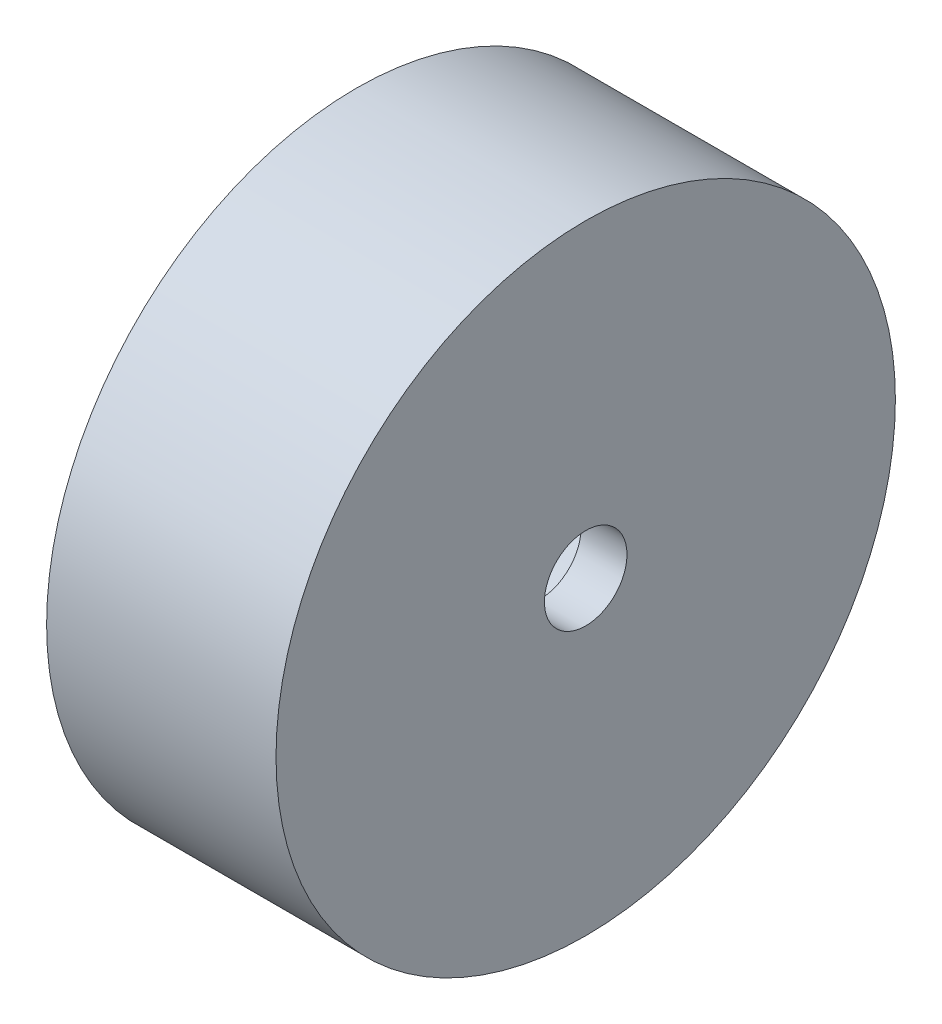
ISO-10303-21;
HEADER;
FILE_DESCRIPTION(('STEP AP214'),'2;1');
FILE_NAME('part.step','',(''),(''),'','','');
FILE_SCHEMA(('AUTOMOTIVE_DESIGN { 1 0 10303 214 1 1 1 1 }'));
ENDSEC;
DATA;
#1=APPLICATION_CONTEXT('core data for automotive mechanical design processes');
#2=APPLICATION_PROTOCOL_DEFINITION('international standard','automotive_design',2000,#1);
#3=PRODUCT_CONTEXT('',#1,'mechanical');
#4=PRODUCT('Part','Part','',(#3));
#5=PRODUCT_RELATED_PRODUCT_CATEGORY('part','',(#4));
#6=PRODUCT_DEFINITION_FORMATION('','',#4);
#7=PRODUCT_DEFINITION_CONTEXT('part definition',#1,'design');
#8=PRODUCT_DEFINITION('design','',#6,#7);
#9=PRODUCT_DEFINITION_SHAPE('','',#8);
#10=(LENGTH_UNIT() NAMED_UNIT(*) SI_UNIT(.MILLI.,.METRE.));
#11=(NAMED_UNIT(*) PLANE_ANGLE_UNIT() SI_UNIT($,.RADIAN.));
#12=(NAMED_UNIT(*) SI_UNIT($,.STERADIAN.) SOLID_ANGLE_UNIT());
#13=UNCERTAINTY_MEASURE_WITH_UNIT(LENGTH_MEASURE(1.E-05),#10,'distance_accuracy_value','');
#14=(GEOMETRIC_REPRESENTATION_CONTEXT(3) GLOBAL_UNCERTAINTY_ASSIGNED_CONTEXT((#13)) GLOBAL_UNIT_ASSIGNED_CONTEXT((#10,
#11,#12)) REPRESENTATION_CONTEXT('',''));
#15=CARTESIAN_POINT('',(0.,0.,0.));
#16=DIRECTION('',(0.,0.,1.));
#17=DIRECTION('',(1.,0.,0.));
#18=AXIS2_PLACEMENT_3D('',#15,#16,#17);
#19=CARTESIAN_POINT('',(45.,0.,0.));
#20=DIRECTION('',(1.,0.,0.));
#21=DIRECTION('',(0.,0.,-1.));
#22=AXIS2_PLACEMENT_3D('',#19,#20,#21);
#23=PLANE('',#22);
#24=CARTESIAN_POINT('',(45.,0.,0.));
#25=DIRECTION('',(1.,0.,0.));
#26=DIRECTION('',(0.,0.,-1.));
#27=AXIS2_PLACEMENT_3D('',#24,#25,#26);
#28=CIRCLE('',#27,1.8);
#29=CARTESIAN_POINT('',(45.,0.,-1.8));
#30=VERTEX_POINT('',#29);
#31=EDGE_CURVE('E151',#30,#30,#28,.T.);
#32=ORIENTED_EDGE('',*,*,#31,.F.);
#33=EDGE_LOOP('',(#32));
#34=FACE_BOUND('',#33,.T.);
#35=CARTESIAN_POINT('',(45.,0.,0.));
#36=DIRECTION('',(1.,0.,0.));
#37=DIRECTION('',(0.,0.,-1.));
#38=AXIS2_PLACEMENT_3D('',#35,#36,#37);
#39=CIRCLE('',#38,13.5);
#40=CARTESIAN_POINT('',(45.,0.,-13.5));
#41=VERTEX_POINT('',#40);
#42=EDGE_CURVE('E162',#41,#41,#39,.F.);
#43=ORIENTED_EDGE('',*,*,#42,.F.);
#44=EDGE_LOOP('',(#43));
#45=FACE_BOUND('',#44,.T.);
#46=ADVANCED_FACE('F34',(#34,#45),#23,.T.);
#47=CARTESIAN_POINT('',(38.,0.,0.));
#48=DIRECTION('',(-1.,0.,0.));
#49=DIRECTION('',(0.,0.,1.));
#50=AXIS2_PLACEMENT_3D('',#47,#48,#49);
#51=PLANE('',#50);
#52=DIRECTION('',(0.,0.5,-0.866025403784439));
#53=VECTOR('',#52,1.);
#54=CARTESIAN_POINT('',(38.,4.99407982849026,8.65));
#55=LINE('',#54,#53);
#56=CARTESIAN_POINT('',(38.,4.99407982849026,8.65));
#57=VERTEX_POINT('',#56);
#58=CARTESIAN_POINT('',(38.,9.98815965698052,0.));
#59=VERTEX_POINT('',#58);
#60=EDGE_CURVE('E122',#57,#59,#55,.T.);
#61=ORIENTED_EDGE('',*,*,#60,.F.);
#62=DIRECTION('',(0.,1.,0.));
#63=VECTOR('',#62,1.);
#64=CARTESIAN_POINT('',(38.,-4.99407982849027,8.65));
#65=LINE('',#64,#63);
#66=CARTESIAN_POINT('',(38.,-4.99407982849027,8.65));
#67=VERTEX_POINT('',#66);
#68=EDGE_CURVE('E97',#67,#57,#65,.T.);
#69=ORIENTED_EDGE('',*,*,#68,.F.);
#70=DIRECTION('',(0.,0.5,0.866025403784439));
#71=VECTOR('',#70,1.);
#72=CARTESIAN_POINT('',(38.,-9.98815965698053,0.));
#73=LINE('',#72,#71);
#74=CARTESIAN_POINT('',(38.,-9.98815965698053,0.));
#75=VERTEX_POINT('',#74);
#76=EDGE_CURVE('E102',#75,#67,#73,.T.);
#77=ORIENTED_EDGE('',*,*,#76,.F.);
#78=DIRECTION('',(0.,-0.500000000000001,0.866025403784438));
#79=VECTOR('',#78,1.);
#80=CARTESIAN_POINT('',(38.,-4.99407982849026,-8.65));
#81=LINE('',#80,#79);
#82=CARTESIAN_POINT('',(38.,-4.99407982849026,-8.65));
#83=VERTEX_POINT('',#82);
#84=EDGE_CURVE('E106',#83,#75,#81,.T.);
#85=ORIENTED_EDGE('',*,*,#84,.F.);
#86=DIRECTION('',(0.,-1.,0.));
#87=VECTOR('',#86,1.);
#88=CARTESIAN_POINT('',(38.,4.99407982849026,-8.65));
#89=LINE('',#88,#87);
#90=CARTESIAN_POINT('',(38.,4.99407982849026,-8.65));
#91=VERTEX_POINT('',#90);
#92=EDGE_CURVE('E135',#91,#83,#89,.T.);
#93=ORIENTED_EDGE('',*,*,#92,.F.);
#94=DIRECTION('',(0.,-0.5,-0.866025403784439));
#95=VECTOR('',#94,1.);
#96=CARTESIAN_POINT('',(38.,9.98815965698052,0.));
#97=LINE('',#96,#95);
#98=EDGE_CURVE('E127',#59,#91,#97,.T.);
#99=ORIENTED_EDGE('',*,*,#98,.F.);
#100=EDGE_LOOP('',(#61,#69,#77,#85,#93,#99));
#101=FACE_BOUND('',#100,.T.);
#102=CARTESIAN_POINT('',(38.,0.,0.));
#103=DIRECTION('',(-1.,0.,0.));
#104=DIRECTION('',(0.,0.,1.));
#105=AXIS2_PLACEMENT_3D('',#102,#103,#104);
#106=CIRCLE('',#105,10.175);
#107=CARTESIAN_POINT('',(38.,0.,10.175));
#108=VERTEX_POINT('',#107);
#109=EDGE_CURVE('E11',#108,#108,#106,.F.);
#110=ORIENTED_EDGE('',*,*,#109,.F.);
#111=EDGE_LOOP('',(#110));
#112=FACE_BOUND('',#111,.T.);
#113=ADVANCED_FACE('F132',(#101,#112),#51,.T.);
#114=CARTESIAN_POINT('',(38.,-4.99407982849027,8.65));
#115=DIRECTION('',(0.,0.,-1.));
#116=DIRECTION('',(-1.,0.,0.));
#117=AXIS2_PLACEMENT_3D('',#114,#115,#116);
#118=PLANE('',#117);
#119=DIRECTION('',(1.,0.,0.));
#120=VECTOR('',#119,1.);
#121=CARTESIAN_POINT('',(38.,4.99407982849026,8.65));
#122=LINE('',#121,#120);
#123=CARTESIAN_POINT('',(43.,4.99407982849026,8.65));
#124=VERTEX_POINT('',#123);
#125=EDGE_CURVE('E89',#57,#124,#122,.T.);
#126=ORIENTED_EDGE('',*,*,#125,.T.);
#127=DIRECTION('',(0.,-1.,0.));
#128=VECTOR('',#127,1.);
#129=CARTESIAN_POINT('',(43.,-4.99407982849027,8.65));
#130=LINE('',#129,#128);
#131=CARTESIAN_POINT('',(43.,-4.99407982849027,8.65));
#132=VERTEX_POINT('',#131);
#133=EDGE_CURVE('E86',#124,#132,#130,.T.);
#134=ORIENTED_EDGE('',*,*,#133,.T.);
#135=DIRECTION('',(1.,0.,0.));
#136=VECTOR('',#135,1.);
#137=CARTESIAN_POINT('',(38.,-4.99407982849027,8.65));
#138=LINE('',#137,#136);
#139=EDGE_CURVE('E94',#67,#132,#138,.T.);
#140=ORIENTED_EDGE('',*,*,#139,.F.);
#141=ORIENTED_EDGE('',*,*,#68,.T.);
#142=EDGE_LOOP('',(#126,#134,#140,#141));
#143=FACE_BOUND('',#142,.T.);
#144=ADVANCED_FACE('F93',(#143),#118,.T.);
#145=CARTESIAN_POINT('',(38.,4.99407982849026,8.65));
#146=DIRECTION('',(0.,-0.866025403784439,-0.5));
#147=DIRECTION('',(0.,0.5,-0.866025403784439));
#148=AXIS2_PLACEMENT_3D('',#145,#146,#147);
#149=PLANE('',#148);
#150=DIRECTION('',(1.,0.,0.));
#151=VECTOR('',#150,1.);
#152=CARTESIAN_POINT('',(38.,9.98815965698052,0.));
#153=LINE('',#152,#151);
#154=CARTESIAN_POINT('',(43.,9.98815965698052,0.));
#155=VERTEX_POINT('',#154);
#156=EDGE_CURVE('E115',#59,#155,#153,.T.);
#157=ORIENTED_EDGE('',*,*,#156,.T.);
#158=DIRECTION('',(0.,-0.5,0.866025403784439));
#159=VECTOR('',#158,1.);
#160=CARTESIAN_POINT('',(43.,4.99407982849026,8.65));
#161=LINE('',#160,#159);
#162=EDGE_CURVE('E98',#155,#124,#161,.T.);
#163=ORIENTED_EDGE('',*,*,#162,.T.);
#164=ORIENTED_EDGE('',*,*,#125,.F.);
#165=ORIENTED_EDGE('',*,*,#60,.T.);
#166=EDGE_LOOP('',(#157,#163,#164,#165));
#167=FACE_BOUND('',#166,.T.);
#168=ADVANCED_FACE('F120',(#167),#149,.T.);
#169=CARTESIAN_POINT('',(38.,9.98815965698052,0.));
#170=DIRECTION('',(0.,-0.866025403784439,0.5));
#171=DIRECTION('',(0.,-0.5,-0.866025403784439));
#172=AXIS2_PLACEMENT_3D('',#169,#170,#171);
#173=PLANE('',#172);
#174=DIRECTION('',(1.,0.,0.));
#175=VECTOR('',#174,1.);
#176=CARTESIAN_POINT('',(38.,4.99407982849026,-8.65));
#177=LINE('',#176,#175);
#178=CARTESIAN_POINT('',(43.,4.99407982849026,-8.65));
#179=VERTEX_POINT('',#178);
#180=EDGE_CURVE('E112',#91,#179,#177,.T.);
#181=ORIENTED_EDGE('',*,*,#180,.T.);
#182=DIRECTION('',(0.,0.5,0.866025403784439));
#183=VECTOR('',#182,1.);
#184=CARTESIAN_POINT('',(43.,9.98815965698052,0.));
#185=LINE('',#184,#183);
#186=EDGE_CURVE('E129',#179,#155,#185,.T.);
#187=ORIENTED_EDGE('',*,*,#186,.T.);
#188=ORIENTED_EDGE('',*,*,#156,.F.);
#189=ORIENTED_EDGE('',*,*,#98,.T.);
#190=EDGE_LOOP('',(#181,#187,#188,#189));
#191=FACE_BOUND('',#190,.T.);
#192=ADVANCED_FACE('F126',(#191),#173,.T.);
#193=CARTESIAN_POINT('',(38.,4.99407982849026,-8.65));
#194=DIRECTION('',(0.,0.,1.));
#195=DIRECTION('',(0.,-1.,0.));
#196=AXIS2_PLACEMENT_3D('',#193,#194,#195);
#197=PLANE('',#196);
#198=DIRECTION('',(1.,0.,0.));
#199=VECTOR('',#198,1.);
#200=CARTESIAN_POINT('',(38.,-4.99407982849026,-8.65));
#201=LINE('',#200,#199);
#202=CARTESIAN_POINT('',(43.,-4.99407982849026,-8.65));
#203=VERTEX_POINT('',#202);
#204=EDGE_CURVE('E104',#83,#203,#201,.T.);
#205=ORIENTED_EDGE('',*,*,#204,.T.);
#206=DIRECTION('',(0.,1.,0.));
#207=VECTOR('',#206,1.);
#208=CARTESIAN_POINT('',(43.,4.99407982849026,-8.65));
#209=LINE('',#208,#207);
#210=EDGE_CURVE('E146',#203,#179,#209,.T.);
#211=ORIENTED_EDGE('',*,*,#210,.T.);
#212=ORIENTED_EDGE('',*,*,#180,.F.);
#213=ORIENTED_EDGE('',*,*,#92,.T.);
#214=EDGE_LOOP('',(#205,#211,#212,#213));
#215=FACE_BOUND('',#214,.T.);
#216=ADVANCED_FACE('F194',(#215),#197,.T.);
#217=CARTESIAN_POINT('',(38.,-4.99407982849026,-8.65));
#218=DIRECTION('',(0.,0.866025403784438,0.500000000000001));
#219=DIRECTION('',(0.,-0.500000000000001,0.866025403784438));
#220=AXIS2_PLACEMENT_3D('',#217,#218,#219);
#221=PLANE('',#220);
#222=DIRECTION('',(1.,0.,0.));
#223=VECTOR('',#222,1.);
#224=CARTESIAN_POINT('',(38.,-9.98815965698053,0.));
#225=LINE('',#224,#223);
#226=CARTESIAN_POINT('',(43.,-9.98815965698053,0.));
#227=VERTEX_POINT('',#226);
#228=EDGE_CURVE('E55',#75,#227,#225,.T.);
#229=ORIENTED_EDGE('',*,*,#228,.T.);
#230=DIRECTION('',(0.,0.500000000000001,-0.866025403784438));
#231=VECTOR('',#230,1.);
#232=CARTESIAN_POINT('',(43.,-4.99407982849026,-8.65));
#233=LINE('',#232,#231);
#234=EDGE_CURVE('E48',#227,#203,#233,.T.);
#235=ORIENTED_EDGE('',*,*,#234,.T.);
#236=ORIENTED_EDGE('',*,*,#204,.F.);
#237=ORIENTED_EDGE('',*,*,#84,.T.);
#238=EDGE_LOOP('',(#229,#235,#236,#237));
#239=FACE_BOUND('',#238,.T.);
#240=ADVANCED_FACE('F142',(#239),#221,.T.);
#241=CARTESIAN_POINT('',(38.,-9.98815965698053,0.));
#242=DIRECTION('',(0.,0.866025403784439,-0.5));
#243=DIRECTION('',(0.,0.5,0.866025403784439));
#244=AXIS2_PLACEMENT_3D('',#241,#242,#243);
#245=PLANE('',#244);
#246=ORIENTED_EDGE('',*,*,#139,.T.);
#247=DIRECTION('',(0.,-0.5,-0.866025403784439));
#248=VECTOR('',#247,1.);
#249=CARTESIAN_POINT('',(43.,-9.98815965698053,0.));
#250=LINE('',#249,#248);
#251=EDGE_CURVE('E41',#132,#227,#250,.T.);
#252=ORIENTED_EDGE('',*,*,#251,.T.);
#253=ORIENTED_EDGE('',*,*,#228,.F.);
#254=ORIENTED_EDGE('',*,*,#76,.T.);
#255=EDGE_LOOP('',(#246,#252,#253,#254));
#256=FACE_BOUND('',#255,.T.);
#257=ADVANCED_FACE('F100',(#256),#245,.T.);
#258=CARTESIAN_POINT('',(43.,0.,0.));
#259=DIRECTION('',(1.,0.,0.));
#260=DIRECTION('',(0.,0.,-1.));
#261=AXIS2_PLACEMENT_3D('',#258,#259,#260);
#262=PLANE('',#261);
#263=ORIENTED_EDGE('',*,*,#133,.F.);
#264=ORIENTED_EDGE('',*,*,#162,.F.);
#265=ORIENTED_EDGE('',*,*,#186,.F.);
#266=ORIENTED_EDGE('',*,*,#210,.F.);
#267=ORIENTED_EDGE('',*,*,#234,.F.);
#268=ORIENTED_EDGE('',*,*,#251,.F.);
#269=EDGE_LOOP('',(#263,#264,#265,#266,#267,#268));
#270=FACE_BOUND('',#269,.T.);
#271=CARTESIAN_POINT('',(43.,0.,0.));
#272=DIRECTION('',(1.,0.,0.));
#273=DIRECTION('',(0.,0.,-1.));
#274=AXIS2_PLACEMENT_3D('',#271,#272,#273);
#275=CIRCLE('',#274,1.8);
#276=CARTESIAN_POINT('',(43.,0.,-1.8));
#277=VERTEX_POINT('',#276);
#278=EDGE_CURVE('E150',#277,#277,#275,.T.);
#279=ORIENTED_EDGE('',*,*,#278,.T.);
#280=EDGE_LOOP('',(#279));
#281=FACE_BOUND('',#280,.T.);
#282=ADVANCED_FACE('F84',(#270,#281),#262,.F.);
#283=CARTESIAN_POINT('',(43.,0.,0.));
#284=DIRECTION('',(1.,0.,0.));
#285=DIRECTION('',(0.,0.,-1.));
#286=AXIS2_PLACEMENT_3D('',#283,#284,#285);
#287=CYLINDRICAL_SURFACE('',#286,1.8);
#288=ORIENTED_EDGE('',*,*,#278,.F.);
#289=EDGE_LOOP('',(#288));
#290=FACE_BOUND('',#289,.T.);
#291=ORIENTED_EDGE('',*,*,#31,.T.);
#292=EDGE_LOOP('',(#291));
#293=FACE_BOUND('',#292,.T.);
#294=ADVANCED_FACE('F175',(#290,#293),#287,.F.);
#295=CARTESIAN_POINT('',(35.,0.,0.));
#296=DIRECTION('',(-1.,0.,0.));
#297=DIRECTION('',(0.,0.,1.));
#298=AXIS2_PLACEMENT_3D('',#295,#296,#297);
#299=PLANE('',#298);
#300=CARTESIAN_POINT('',(35.,0.,0.));
#301=DIRECTION('',(-1.,0.,0.));
#302=DIRECTION('',(0.,0.,1.));
#303=AXIS2_PLACEMENT_3D('',#300,#301,#302);
#304=CIRCLE('',#303,13.5);
#305=CARTESIAN_POINT('',(35.,0.,13.5));
#306=VERTEX_POINT('',#305);
#307=EDGE_CURVE('E154',#306,#306,#304,.T.);
#308=ORIENTED_EDGE('',*,*,#307,.T.);
#309=EDGE_LOOP('',(#308));
#310=FACE_BOUND('',#309,.T.);
#311=CARTESIAN_POINT('',(35.,0.,0.));
#312=DIRECTION('',(-1.,0.,0.));
#313=DIRECTION('',(0.,0.,1.));
#314=AXIS2_PLACEMENT_3D('',#311,#312,#313);
#315=CIRCLE('',#314,10.175);
#316=CARTESIAN_POINT('',(35.,0.,10.175));
#317=VERTEX_POINT('',#316);
#318=EDGE_CURVE('E159',#317,#317,#315,.T.);
#319=ORIENTED_EDGE('',*,*,#318,.F.);
#320=EDGE_LOOP('',(#319));
#321=FACE_BOUND('',#320,.T.);
#322=ADVANCED_FACE('F177',(#310,#321),#299,.T.);
#323=CARTESIAN_POINT('',(35.,0.,0.));
#324=DIRECTION('',(1.,0.,0.));
#325=DIRECTION('',(0.,0.,-1.));
#326=AXIS2_PLACEMENT_3D('',#323,#324,#325);
#327=CYLINDRICAL_SURFACE('',#326,13.5);
#328=ORIENTED_EDGE('',*,*,#307,.F.);
#329=EDGE_LOOP('',(#328));
#330=FACE_BOUND('',#329,.T.);
#331=ORIENTED_EDGE('',*,*,#42,.T.);
#332=EDGE_LOOP('',(#331));
#333=FACE_BOUND('',#332,.T.);
#334=ADVANCED_FACE('F166',(#330,#333),#327,.T.);
#335=CARTESIAN_POINT('',(35.,0.,0.));
#336=DIRECTION('',(1.,0.,0.));
#337=DIRECTION('',(0.,0.,-1.));
#338=AXIS2_PLACEMENT_3D('',#335,#336,#337);
#339=CYLINDRICAL_SURFACE('',#338,10.175);
#340=ORIENTED_EDGE('',*,*,#318,.T.);
#341=EDGE_LOOP('',(#340));
#342=FACE_BOUND('',#341,.T.);
#343=ORIENTED_EDGE('',*,*,#109,.T.);
#344=EDGE_LOOP('',(#343));
#345=FACE_BOUND('',#344,.T.);
#346=ADVANCED_FACE('F252',(#342,#345),#339,.F.);
#347=CLOSED_SHELL('',(#46,#113,#144,#168,#192,#216,#240,#257,#282,#294,#322,#334,#346));
#348=MANIFOLD_SOLID_BREP('B2',#347);
#349=ADVANCED_BREP_SHAPE_REPRESENTATION('',(#18,#348),#14);
#350=SHAPE_DEFINITION_REPRESENTATION(#9,#349);
ENDSEC;
END-ISO-10303-21;
